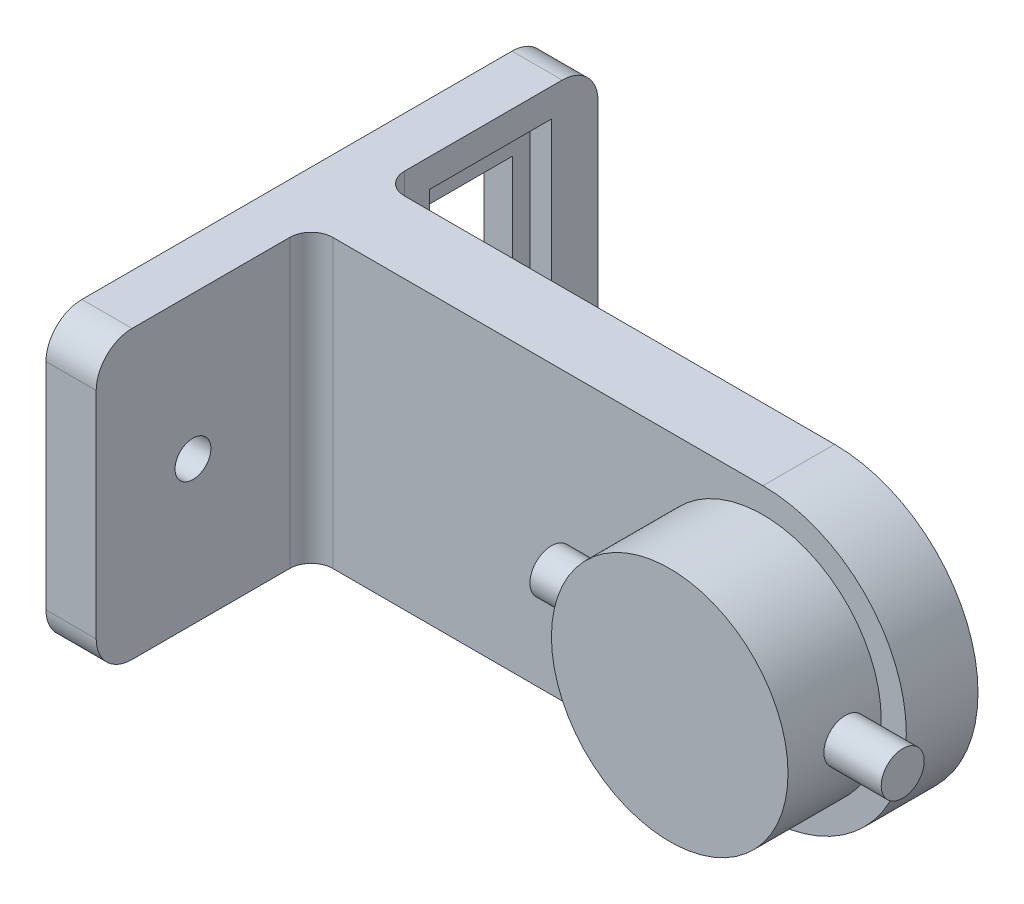
ISO-10303-21;
HEADER;
FILE_DESCRIPTION(('STEP AP214'),'2;1');
FILE_NAME('part.step','',(''),(''),'','','');
FILE_SCHEMA(('AUTOMOTIVE_DESIGN { 1 0 10303 214 1 1 1 1 }'));
ENDSEC;
DATA;
#1=APPLICATION_CONTEXT('core data for automotive mechanical design processes');
#2=APPLICATION_PROTOCOL_DEFINITION('international standard','automotive_design',2000,#1);
#3=PRODUCT_CONTEXT('',#1,'mechanical');
#4=PRODUCT('Part','Part','',(#3));
#5=PRODUCT_RELATED_PRODUCT_CATEGORY('part','',(#4));
#6=PRODUCT_DEFINITION_FORMATION('','',#4);
#7=PRODUCT_DEFINITION_CONTEXT('part definition',#1,'design');
#8=PRODUCT_DEFINITION('design','',#6,#7);
#9=PRODUCT_DEFINITION_SHAPE('','',#8);
#10=(LENGTH_UNIT() NAMED_UNIT(*) SI_UNIT(.MILLI.,.METRE.));
#11=(NAMED_UNIT(*) PLANE_ANGLE_UNIT() SI_UNIT($,.RADIAN.));
#12=(NAMED_UNIT(*) SI_UNIT($,.STERADIAN.) SOLID_ANGLE_UNIT());
#13=UNCERTAINTY_MEASURE_WITH_UNIT(LENGTH_MEASURE(1.E-05),#10,'distance_accuracy_value','');
#14=(GEOMETRIC_REPRESENTATION_CONTEXT(3) GLOBAL_UNCERTAINTY_ASSIGNED_CONTEXT((#13)) GLOBAL_UNIT_ASSIGNED_CONTEXT((#10,
#11,#12)) REPRESENTATION_CONTEXT('',''));
#15=CARTESIAN_POINT('',(0.,0.,0.));
#16=DIRECTION('',(0.,0.,1.));
#17=DIRECTION('',(1.,0.,0.));
#18=AXIS2_PLACEMENT_3D('',#15,#16,#17);
#19=CARTESIAN_POINT('',(0.499999999999973,0.,15.));
#20=DIRECTION('',(1.,0.,0.));
#21=DIRECTION('',(0.,1.,0.));
#22=AXIS2_PLACEMENT_3D('',#19,#20,#21);
#23=CYLINDRICAL_SURFACE('',#22,3.);
#24=CARTESIAN_POINT('',(0.499999999999973,0.,15.));
#25=DIRECTION('',(-1.,0.,0.));
#26=DIRECTION('',(0.,-1.,0.));
#27=AXIS2_PLACEMENT_3D('',#24,#25,#26);
#28=CIRCLE('',#27,3.);
#29=CARTESIAN_POINT('',(0.499999999999972,-3.,15.));
#30=VERTEX_POINT('',#29);
#31=EDGE_CURVE('E11',#30,#30,#28,.T.);
#32=ORIENTED_EDGE('',*,*,#31,.F.);
#33=EDGE_LOOP('',(#32));
#34=FACE_BOUND('',#33,.T.);
#35=CARTESIAN_POINT('',(8.49999999999997,0.,15.));
#36=DIRECTION('',(-1.,0.,0.));
#37=DIRECTION('',(0.,-1.,0.));
#38=AXIS2_PLACEMENT_3D('',#35,#36,#37);
#39=CIRCLE('',#38,3.);
#40=CARTESIAN_POINT('',(8.49999999999997,-3.,15.));
#41=VERTEX_POINT('',#40);
#42=EDGE_CURVE('E49',#41,#41,#39,.T.);
#43=ORIENTED_EDGE('',*,*,#42,.T.);
#44=EDGE_LOOP('',(#43));
#45=FACE_BOUND('',#44,.T.);
#46=ADVANCED_FACE('F46',(#34,#45),#23,.T.);
#47=CARTESIAN_POINT('',(0.499999999999973,0.,15.));
#48=DIRECTION('',(-1.,0.,0.));
#49=DIRECTION('',(0.,-1.,0.));
#50=AXIS2_PLACEMENT_3D('',#47,#48,#49);
#51=PLANE('',#50);
#52=ORIENTED_EDGE('',*,*,#31,.T.);
#53=EDGE_LOOP('',(#52));
#54=FACE_BOUND('',#53,.T.);
#55=ADVANCED_FACE('F61',(#54),#51,.T.);
#56=CARTESIAN_POINT('',(8.49999999999997,0.,15.));
#57=DIRECTION('',(-1.,0.,0.));
#58=DIRECTION('',(0.,-1.,0.));
#59=AXIS2_PLACEMENT_3D('',#56,#57,#58);
#60=PLANE('',#59);
#61=ORIENTED_EDGE('',*,*,#42,.F.);
#62=EDGE_LOOP('',(#61));
#63=FACE_BOUND('',#62,.T.);
#64=ADVANCED_FACE('F59',(#63),#60,.F.);
#65=CLOSED_SHELL('',(#46,#55,#64));
#66=MANIFOLD_SOLID_BREP('B2',#65);
#67=CARTESIAN_POINT('',(49.5,0.,15.));
#68=DIRECTION('',(-1.,0.,0.));
#69=DIRECTION('',(0.,-1.,0.));
#70=AXIS2_PLACEMENT_3D('',#67,#68,#69);
#71=CYLINDRICAL_SURFACE('',#70,3.);
#72=CARTESIAN_POINT('',(49.5,0.,15.));
#73=DIRECTION('',(1.,0.,0.));
#74=DIRECTION('',(0.,1.,0.));
#75=AXIS2_PLACEMENT_3D('',#72,#73,#74);
#76=CIRCLE('',#75,3.);
#77=CARTESIAN_POINT('',(49.5,3.,15.));
#78=VERTEX_POINT('',#77);
#79=EDGE_CURVE('E45',#78,#78,#76,.T.);
#80=ORIENTED_EDGE('',*,*,#79,.F.);
#81=EDGE_LOOP('',(#80));
#82=FACE_BOUND('',#81,.T.);
#83=CARTESIAN_POINT('',(41.5,0.,15.));
#84=DIRECTION('',(1.,0.,0.));
#85=DIRECTION('',(0.,1.,0.));
#86=AXIS2_PLACEMENT_3D('',#83,#84,#85);
#87=CIRCLE('',#86,3.);
#88=CARTESIAN_POINT('',(41.5,3.,15.));
#89=VERTEX_POINT('',#88);
#90=EDGE_CURVE('E105',#89,#89,#87,.T.);
#91=ORIENTED_EDGE('',*,*,#90,.T.);
#92=EDGE_LOOP('',(#91));
#93=FACE_BOUND('',#92,.T.);
#94=ADVANCED_FACE('F102',(#82,#93),#71,.T.);
#95=CARTESIAN_POINT('',(49.5,0.,15.));
#96=DIRECTION('',(1.,0.,0.));
#97=DIRECTION('',(0.,1.,0.));
#98=AXIS2_PLACEMENT_3D('',#95,#96,#97);
#99=PLANE('',#98);
#100=ORIENTED_EDGE('',*,*,#79,.T.);
#101=EDGE_LOOP('',(#100));
#102=FACE_BOUND('',#101,.T.);
#103=ADVANCED_FACE('F117',(#102),#99,.T.);
#104=CARTESIAN_POINT('',(41.5,0.,15.));
#105=DIRECTION('',(1.,0.,0.));
#106=DIRECTION('',(0.,1.,0.));
#107=AXIS2_PLACEMENT_3D('',#104,#105,#106);
#108=PLANE('',#107);
#109=ORIENTED_EDGE('',*,*,#90,.F.);
#110=EDGE_LOOP('',(#109));
#111=FACE_BOUND('',#110,.T.);
#112=ADVANCED_FACE('F115',(#111),#108,.F.);
#113=CLOSED_SHELL('',(#94,#103,#112));
#114=MANIFOLD_SOLID_BREP('B6',#113);
#115=CARTESIAN_POINT('',(-48.,11.275,-21.075));
#116=DIRECTION('',(0.,0.,1.));
#117=DIRECTION('',(1.,0.,0.));
#118=AXIS2_PLACEMENT_3D('',#115,#116,#117);
#119=PLANE('',#118);
#120=DIRECTION('',(1.,0.,0.));
#121=VECTOR('',#120,1.);
#122=CARTESIAN_POINT('',(-48.,-11.275,-21.075));
#123=LINE('',#122,#121);
#124=CARTESIAN_POINT('',(-45.,-11.275,-21.075));
#125=VERTEX_POINT('',#124);
#126=CARTESIAN_POINT('',(-41.,-11.275,-21.075));
#127=VERTEX_POINT('',#126);
#128=EDGE_CURVE('E360',#125,#127,#123,.T.);
#129=ORIENTED_EDGE('',*,*,#128,.T.);
#130=DIRECTION('',(0.,1.,0.));
#131=VECTOR('',#130,1.);
#132=CARTESIAN_POINT('',(-41.,11.275,-21.075));
#133=LINE('',#132,#131);
#134=CARTESIAN_POINT('',(-41.,11.275,-21.075));
#135=VERTEX_POINT('',#134);
#136=EDGE_CURVE('E348',#127,#135,#133,.T.);
#137=ORIENTED_EDGE('',*,*,#136,.T.);
#138=DIRECTION('',(1.,0.,0.));
#139=VECTOR('',#138,1.);
#140=CARTESIAN_POINT('',(-48.,11.275,-21.075));
#141=LINE('',#140,#139);
#142=CARTESIAN_POINT('',(-45.,11.275,-21.075));
#143=VERTEX_POINT('',#142);
#144=EDGE_CURVE('E351',#143,#135,#141,.T.);
#145=ORIENTED_EDGE('',*,*,#144,.F.);
#146=DIRECTION('',(0.,-1.,0.));
#147=VECTOR('',#146,1.);
#148=CARTESIAN_POINT('',(-45.,20.,-21.075));
#149=LINE('',#148,#147);
#150=EDGE_CURVE('E371',#143,#125,#149,.T.);
#151=ORIENTED_EDGE('',*,*,#150,.T.);
#152=EDGE_LOOP('',(#129,#137,#145,#151));
#153=FACE_BOUND('',#152,.T.);
#154=ADVANCED_FACE('F149',(#153),#119,.T.);
#155=CARTESIAN_POINT('',(-48.,-11.275,-21.075));
#156=DIRECTION('',(0.,1.,0.));
#157=DIRECTION('',(0.,0.,1.));
#158=AXIS2_PLACEMENT_3D('',#155,#156,#157);
#159=PLANE('',#158);
#160=DIRECTION('',(1.,0.,0.));
#161=VECTOR('',#160,1.);
#162=CARTESIAN_POINT('',(-48.,-11.275,-8.92500000000001));
#163=LINE('',#162,#161);
#164=CARTESIAN_POINT('',(-45.,-11.275,-8.92500000000001));
#165=VERTEX_POINT('',#164);
#166=CARTESIAN_POINT('',(-41.,-11.275,-8.92500000000001));
#167=VERTEX_POINT('',#166);
#168=EDGE_CURVE('E357',#165,#167,#163,.T.);
#169=ORIENTED_EDGE('',*,*,#168,.T.);
#170=DIRECTION('',(0.,0.,-1.));
#171=VECTOR('',#170,1.);
#172=CARTESIAN_POINT('',(-41.,-11.275,-21.075));
#173=LINE('',#172,#171);
#174=EDGE_CURVE('E345',#167,#127,#173,.T.);
#175=ORIENTED_EDGE('',*,*,#174,.T.);
#176=ORIENTED_EDGE('',*,*,#128,.F.);
#177=DIRECTION('',(0.,0.,1.));
#178=VECTOR('',#177,1.);
#179=CARTESIAN_POINT('',(-45.,-11.275,9.99999999999999));
#180=LINE('',#179,#178);
#181=EDGE_CURVE('E369',#125,#165,#180,.T.);
#182=ORIENTED_EDGE('',*,*,#181,.T.);
#183=EDGE_LOOP('',(#169,#175,#176,#182));
#184=FACE_BOUND('',#183,.T.);
#185=ADVANCED_FACE('F546',(#184),#159,.T.);
#186=CARTESIAN_POINT('',(-48.,11.275,-8.925));
#187=DIRECTION('',(0.,0.,1.));
#188=DIRECTION('',(0.,-1.,0.));
#189=AXIS2_PLACEMENT_3D('',#186,#187,#188);
#190=PLANE('',#189);
#191=DIRECTION('',(0.,1.,0.));
#192=VECTOR('',#191,1.);
#193=CARTESIAN_POINT('',(-41.,11.275,-8.925));
#194=LINE('',#193,#192);
#195=CARTESIAN_POINT('',(-41.,11.275,-8.925));
#196=VERTEX_POINT('',#195);
#197=EDGE_CURVE('E340',#167,#196,#194,.T.);
#198=ORIENTED_EDGE('',*,*,#197,.F.);
#199=ORIENTED_EDGE('',*,*,#168,.F.);
#200=DIRECTION('',(0.,-1.,0.));
#201=VECTOR('',#200,1.);
#202=CARTESIAN_POINT('',(-45.,20.,-8.925));
#203=LINE('',#202,#201);
#204=CARTESIAN_POINT('',(-45.,11.275,-8.92500000000001));
#205=VERTEX_POINT('',#204);
#206=EDGE_CURVE('E366',#205,#165,#203,.T.);
#207=ORIENTED_EDGE('',*,*,#206,.F.);
#208=DIRECTION('',(1.,0.,0.));
#209=VECTOR('',#208,1.);
#210=CARTESIAN_POINT('',(-48.,11.275,-8.925));
#211=LINE('',#210,#209);
#212=EDGE_CURVE('E354',#205,#196,#211,.T.);
#213=ORIENTED_EDGE('',*,*,#212,.T.);
#214=EDGE_LOOP('',(#198,#199,#207,#213));
#215=FACE_BOUND('',#214,.T.);
#216=ADVANCED_FACE('F552',(#215),#190,.F.);
#217=CARTESIAN_POINT('',(-48.,11.275,-21.075));
#218=DIRECTION('',(0.,1.,0.));
#219=DIRECTION('',(0.,0.,1.));
#220=AXIS2_PLACEMENT_3D('',#217,#218,#219);
#221=PLANE('',#220);
#222=DIRECTION('',(0.,0.,-1.));
#223=VECTOR('',#222,1.);
#224=CARTESIAN_POINT('',(-41.,11.275,-21.075));
#225=LINE('',#224,#223);
#226=EDGE_CURVE('E422',#196,#135,#225,.T.);
#227=ORIENTED_EDGE('',*,*,#226,.F.);
#228=ORIENTED_EDGE('',*,*,#212,.F.);
#229=DIRECTION('',(0.,0.,1.));
#230=VECTOR('',#229,1.);
#231=CARTESIAN_POINT('',(-45.,11.275,10.));
#232=LINE('',#231,#230);
#233=EDGE_CURVE('E363',#143,#205,#232,.T.);
#234=ORIENTED_EDGE('',*,*,#233,.F.);
#235=ORIENTED_EDGE('',*,*,#144,.T.);
#236=EDGE_LOOP('',(#227,#228,#234,#235));
#237=FACE_BOUND('',#236,.T.);
#238=ADVANCED_FACE('F584',(#237),#221,.F.);
#239=CARTESIAN_POINT('',(-45.,20.,10.));
#240=DIRECTION('',(1.,0.,0.));
#241=DIRECTION('',(0.,1.,0.));
#242=AXIS2_PLACEMENT_3D('',#239,#240,#241);
#243=PLANE('',#242);
#244=CARTESIAN_POINT('',(-45.,0.,26.5));
#245=DIRECTION('',(1.,0.,0.));
#246=DIRECTION('',(0.,1.,0.));
#247=AXIS2_PLACEMENT_3D('',#244,#245,#246);
#248=CIRCLE('',#247,2.5);
#249=CARTESIAN_POINT('',(-45.,2.5,26.5));
#250=VERTEX_POINT('',#249);
#251=EDGE_CURVE('E334',#250,#250,#248,.T.);
#252=ORIENTED_EDGE('',*,*,#251,.T.);
#253=EDGE_LOOP('',(#252));
#254=FACE_BOUND('',#253,.T.);
#255=DIRECTION('',(0.,0.,-1.));
#256=VECTOR('',#255,1.);
#257=CARTESIAN_POINT('',(-45.,-20.,10.));
#258=LINE('',#257,#256);
#259=CARTESIAN_POINT('',(-45.,-20.,35.));
#260=VERTEX_POINT('',#259);
#261=CARTESIAN_POINT('',(-45.,-20.,-25.));
#262=VERTEX_POINT('',#261);
#263=EDGE_CURVE('E419',#260,#262,#258,.T.);
#264=ORIENTED_EDGE('',*,*,#263,.F.);
#265=CARTESIAN_POINT('',(-45.,-15.,35.));
#266=DIRECTION('',(1.,0.,0.));
#267=DIRECTION('',(0.,1.,0.));
#268=AXIS2_PLACEMENT_3D('',#265,#266,#267);
#269=CIRCLE('',#268,5.);
#270=CARTESIAN_POINT('',(-45.,-15.,40.));
#271=VERTEX_POINT('',#270);
#272=EDGE_CURVE('E454',#260,#271,#269,.F.);
#273=ORIENTED_EDGE('',*,*,#272,.T.);
#274=DIRECTION('',(0.,1.,0.));
#275=VECTOR('',#274,1.);
#276=CARTESIAN_POINT('',(-45.,20.,40.));
#277=LINE('',#276,#275);
#278=CARTESIAN_POINT('',(-45.,15.,40.));
#279=VERTEX_POINT('',#278);
#280=EDGE_CURVE('E387',#271,#279,#277,.T.);
#281=ORIENTED_EDGE('',*,*,#280,.T.);
#282=CARTESIAN_POINT('',(-45.,15.,35.));
#283=DIRECTION('',(1.,0.,0.));
#284=DIRECTION('',(0.,1.,0.));
#285=AXIS2_PLACEMENT_3D('',#282,#283,#284);
#286=CIRCLE('',#285,5.);
#287=CARTESIAN_POINT('',(-45.,20.,35.));
#288=VERTEX_POINT('',#287);
#289=EDGE_CURVE('E452',#279,#288,#286,.F.);
#290=ORIENTED_EDGE('',*,*,#289,.T.);
#291=DIRECTION('',(0.,0.,-1.));
#292=VECTOR('',#291,1.);
#293=CARTESIAN_POINT('',(-45.,20.,10.));
#294=LINE('',#293,#292);
#295=CARTESIAN_POINT('',(-45.,20.,-25.));
#296=VERTEX_POINT('',#295);
#297=EDGE_CURVE('E405',#288,#296,#294,.T.);
#298=ORIENTED_EDGE('',*,*,#297,.T.);
#299=CARTESIAN_POINT('',(-45.,15.,-25.));
#300=DIRECTION('',(1.,0.,0.));
#301=DIRECTION('',(0.,1.,0.));
#302=AXIS2_PLACEMENT_3D('',#299,#300,#301);
#303=CIRCLE('',#302,5.);
#304=CARTESIAN_POINT('',(-45.,15.,-30.));
#305=VERTEX_POINT('',#304);
#306=EDGE_CURVE('E448',#296,#305,#303,.F.);
#307=ORIENTED_EDGE('',*,*,#306,.T.);
#308=DIRECTION('',(0.,1.,0.));
#309=VECTOR('',#308,1.);
#310=CARTESIAN_POINT('',(-45.,20.,-30.));
#311=LINE('',#310,#309);
#312=CARTESIAN_POINT('',(-45.,-15.,-30.));
#313=VERTEX_POINT('',#312);
#314=EDGE_CURVE('E381',#313,#305,#311,.T.);
#315=ORIENTED_EDGE('',*,*,#314,.F.);
#316=CARTESIAN_POINT('',(-45.,-15.,-25.));
#317=DIRECTION('',(1.,0.,0.));
#318=DIRECTION('',(0.,1.,0.));
#319=AXIS2_PLACEMENT_3D('',#316,#317,#318);
#320=CIRCLE('',#319,5.);
#321=EDGE_CURVE('E450',#313,#262,#320,.F.);
#322=ORIENTED_EDGE('',*,*,#321,.T.);
#323=EDGE_LOOP('',(#264,#273,#281,#290,#298,#307,#315,#322));
#324=FACE_BOUND('',#323,.T.);
#325=ORIENTED_EDGE('',*,*,#150,.F.);
#326=ORIENTED_EDGE('',*,*,#233,.T.);
#327=ORIENTED_EDGE('',*,*,#206,.T.);
#328=ORIENTED_EDGE('',*,*,#181,.F.);
#329=EDGE_LOOP('',(#325,#326,#327,#328));
#330=FACE_BOUND('',#329,.T.);
#331=ADVANCED_FACE('F484',(#254,#324,#330),#243,.F.);
#332=CARTESIAN_POINT('',(-38.,20.,40.));
#333=DIRECTION('',(1.,0.,0.));
#334=DIRECTION('',(0.,1.,0.));
#335=AXIS2_PLACEMENT_3D('',#332,#333,#334);
#336=PLANE('',#335);
#337=DIRECTION('',(0.,-1.,0.));
#338=VECTOR('',#337,1.);
#339=CARTESIAN_POINT('',(-38.,16.05,-6.50000000000001));
#340=LINE('',#339,#338);
#341=CARTESIAN_POINT('',(-38.,16.05,-6.50000000000001));
#342=VERTEX_POINT('',#341);
#343=CARTESIAN_POINT('',(-38.,-16.05,-6.50000000000001));
#344=VERTEX_POINT('',#343);
#345=EDGE_CURVE('E304',#342,#344,#340,.T.);
#346=ORIENTED_EDGE('',*,*,#345,.F.);
#347=DIRECTION('',(0.,0.,-1.));
#348=VECTOR('',#347,1.);
#349=CARTESIAN_POINT('',(-38.,16.05,-6.50000000000001));
#350=LINE('',#349,#348);
#351=CARTESIAN_POINT('',(-38.,16.05,-23.5));
#352=VERTEX_POINT('',#351);
#353=EDGE_CURVE('E321',#342,#352,#350,.T.);
#354=ORIENTED_EDGE('',*,*,#353,.T.);
#355=DIRECTION('',(0.,-1.,0.));
#356=VECTOR('',#355,1.);
#357=CARTESIAN_POINT('',(-38.,16.05,-23.5));
#358=LINE('',#357,#356);
#359=CARTESIAN_POINT('',(-38.,-16.05,-23.5));
#360=VERTEX_POINT('',#359);
#361=EDGE_CURVE('E324',#352,#360,#358,.T.);
#362=ORIENTED_EDGE('',*,*,#361,.T.);
#363=DIRECTION('',(0.,0.,-1.));
#364=VECTOR('',#363,1.);
#365=CARTESIAN_POINT('',(-38.,-16.05,-6.50000000000001));
#366=LINE('',#365,#364);
#367=EDGE_CURVE('E333',#344,#360,#366,.T.);
#368=ORIENTED_EDGE('',*,*,#367,.F.);
#369=EDGE_LOOP('',(#346,#354,#362,#368));
#370=FACE_BOUND('',#369,.T.);
#371=DIRECTION('',(0.,0.,-1.));
#372=VECTOR('',#371,1.);
#373=CARTESIAN_POINT('',(-38.,-20.,40.));
#374=LINE('',#373,#372);
#375=CARTESIAN_POINT('',(-38.,-20.,-3.));
#376=VERTEX_POINT('',#375);
#377=CARTESIAN_POINT('',(-38.,-20.,-25.));
#378=VERTEX_POINT('',#377);
#379=EDGE_CURVE('E394',#376,#378,#374,.T.);
#380=ORIENTED_EDGE('',*,*,#379,.T.);
#381=CARTESIAN_POINT('',(-38.,-15.,-25.));
#382=DIRECTION('',(1.,0.,0.));
#383=DIRECTION('',(0.,1.,0.));
#384=AXIS2_PLACEMENT_3D('',#381,#382,#383);
#385=CIRCLE('',#384,5.);
#386=CARTESIAN_POINT('',(-38.,-15.,-30.));
#387=VERTEX_POINT('',#386);
#388=EDGE_CURVE('E100',#378,#387,#385,.T.);
#389=ORIENTED_EDGE('',*,*,#388,.T.);
#390=DIRECTION('',(0.,-1.,0.));
#391=VECTOR('',#390,1.);
#392=CARTESIAN_POINT('',(-38.,20.,-30.));
#393=LINE('',#392,#391);
#394=CARTESIAN_POINT('',(-38.,15.,-30.));
#395=VERTEX_POINT('',#394);
#396=EDGE_CURVE('E377',#395,#387,#393,.T.);
#397=ORIENTED_EDGE('',*,*,#396,.F.);
#398=CARTESIAN_POINT('',(-38.,15.,-25.));
#399=DIRECTION('',(1.,0.,0.));
#400=DIRECTION('',(0.,1.,0.));
#401=AXIS2_PLACEMENT_3D('',#398,#399,#400);
#402=CIRCLE('',#401,5.);
#403=CARTESIAN_POINT('',(-38.,20.,-25.));
#404=VERTEX_POINT('',#403);
#405=EDGE_CURVE('E157',#395,#404,#402,.T.);
#406=ORIENTED_EDGE('',*,*,#405,.T.);
#407=DIRECTION('',(0.,0.,-1.));
#408=VECTOR('',#407,1.);
#409=CARTESIAN_POINT('',(-38.,20.,40.));
#410=LINE('',#409,#408);
#411=CARTESIAN_POINT('',(-38.,20.,-3.));
#412=VERTEX_POINT('',#411);
#413=EDGE_CURVE('E390',#412,#404,#410,.T.);
#414=ORIENTED_EDGE('',*,*,#413,.F.);
#415=DIRECTION('',(0.,1.,0.));
#416=VECTOR('',#415,1.);
#417=CARTESIAN_POINT('',(-38.,20.,-3.));
#418=LINE('',#417,#416);
#419=EDGE_CURVE('E432',#412,#376,#418,.F.);
#420=ORIENTED_EDGE('',*,*,#419,.T.);
#421=EDGE_LOOP('',(#380,#389,#397,#406,#414,#420));
#422=FACE_BOUND('',#421,.T.);
#423=ADVANCED_FACE('F475',(#370,#422),#336,.T.);
#424=CARTESIAN_POINT('',(-45.,-20.,10.));
#425=DIRECTION('',(0.,1.,0.));
#426=DIRECTION('',(-1.,0.,0.));
#427=AXIS2_PLACEMENT_3D('',#424,#425,#426);
#428=PLANE('',#427);
#429=CARTESIAN_POINT('',(-38.,-20.,35.));
#430=VERTEX_POINT('',#429);
#431=CARTESIAN_POINT('',(-38.,-20.,13.));
#432=VERTEX_POINT('',#431);
#433=EDGE_CURVE('E391',#430,#432,#374,.T.);
#434=ORIENTED_EDGE('',*,*,#433,.F.);
#435=DIRECTION('',(-1.,0.,0.));
#436=VECTOR('',#435,1.);
#437=CARTESIAN_POINT('',(-45.,-20.,35.));
#438=LINE('',#437,#436);
#439=EDGE_CURVE('E445',#430,#260,#438,.T.);
#440=ORIENTED_EDGE('',*,*,#439,.T.);
#441=ORIENTED_EDGE('',*,*,#263,.T.);
#442=DIRECTION('',(-1.,0.,0.));
#443=VECTOR('',#442,1.);
#444=CARTESIAN_POINT('',(-38.,-20.,-25.));
#445=LINE('',#444,#443);
#446=EDGE_CURVE('E443',#262,#378,#445,.F.);
#447=ORIENTED_EDGE('',*,*,#446,.T.);
#448=ORIENTED_EDGE('',*,*,#379,.F.);
#449=CARTESIAN_POINT('',(-35.,-20.,-3.));
#450=DIRECTION('',(0.,1.,0.));
#451=DIRECTION('',(-1.,0.,0.));
#452=AXIS2_PLACEMENT_3D('',#449,#450,#451);
#453=CIRCLE('',#452,3.);
#454=CARTESIAN_POINT('',(-35.,-20.,0.));
#455=VERTEX_POINT('',#454);
#456=EDGE_CURVE('E441',#376,#455,#453,.T.);
#457=ORIENTED_EDGE('',*,*,#456,.T.);
#458=DIRECTION('',(1.,0.,0.));
#459=VECTOR('',#458,1.);
#460=CARTESIAN_POINT('',(-45.,-20.,0.));
#461=LINE('',#460,#459);
#462=CARTESIAN_POINT('',(25.,-20.,0.));
#463=VERTEX_POINT('',#462);
#464=EDGE_CURVE('E393',#455,#463,#461,.T.);
#465=ORIENTED_EDGE('',*,*,#464,.T.);
#466=DIRECTION('',(0.,0.,-1.));
#467=VECTOR('',#466,1.);
#468=CARTESIAN_POINT('',(25.,-20.,10.));
#469=LINE('',#468,#467);
#470=CARTESIAN_POINT('',(25.,-20.,10.));
#471=VERTEX_POINT('',#470);
#472=EDGE_CURVE('E416',#471,#463,#469,.T.);
#473=ORIENTED_EDGE('',*,*,#472,.F.);
#474=DIRECTION('',(1.,0.,0.));
#475=VECTOR('',#474,1.);
#476=CARTESIAN_POINT('',(-45.,-20.,10.));
#477=LINE('',#476,#475);
#478=CARTESIAN_POINT('',(-35.,-20.,10.));
#479=VERTEX_POINT('',#478);
#480=EDGE_CURVE('E397',#479,#471,#477,.T.);
#481=ORIENTED_EDGE('',*,*,#480,.F.);
#482=CARTESIAN_POINT('',(-35.,-20.,13.));
#483=DIRECTION('',(0.,1.,0.));
#484=DIRECTION('',(-1.,0.,0.));
#485=AXIS2_PLACEMENT_3D('',#482,#483,#484);
#486=CIRCLE('',#485,3.);
#487=EDGE_CURVE('E436',#479,#432,#486,.T.);
#488=ORIENTED_EDGE('',*,*,#487,.T.);
#489=EDGE_LOOP('',(#434,#440,#441,#447,#448,#457,#465,#473,#481,#488));
#490=FACE_BOUND('',#489,.T.);
#491=ADVANCED_FACE('F494',(#490),#428,.F.);
#492=CARTESIAN_POINT('',(25.,0.,10.));
#493=DIRECTION('',(0.,0.,-1.));
#494=DIRECTION('',(-1.,0.,0.));
#495=AXIS2_PLACEMENT_3D('',#492,#493,#494);
#496=CYLINDRICAL_SURFACE('',#495,20.);
#497=CARTESIAN_POINT('',(25.,0.,0.));
#498=DIRECTION('',(0.,0.,1.));
#499=DIRECTION('',(1.,0.,0.));
#500=AXIS2_PLACEMENT_3D('',#497,#498,#499);
#501=CIRCLE('',#500,20.);
#502=CARTESIAN_POINT('',(25.,20.,0.));
#503=VERTEX_POINT('',#502);
#504=EDGE_CURVE('E407',#463,#503,#501,.T.);
#505=ORIENTED_EDGE('',*,*,#504,.T.);
#506=DIRECTION('',(0.,0.,-1.));
#507=VECTOR('',#506,1.);
#508=CARTESIAN_POINT('',(25.,20.,10.));
#509=LINE('',#508,#507);
#510=CARTESIAN_POINT('',(25.,20.,10.));
#511=VERTEX_POINT('',#510);
#512=EDGE_CURVE('E413',#511,#503,#509,.T.);
#513=ORIENTED_EDGE('',*,*,#512,.F.);
#514=CARTESIAN_POINT('',(25.,0.,10.));
#515=DIRECTION('',(0.,0.,1.));
#516=DIRECTION('',(1.,0.,0.));
#517=AXIS2_PLACEMENT_3D('',#514,#515,#516);
#518=CIRCLE('',#517,20.);
#519=EDGE_CURVE('E399',#471,#511,#518,.T.);
#520=ORIENTED_EDGE('',*,*,#519,.F.);
#521=ORIENTED_EDGE('',*,*,#472,.T.);
#522=EDGE_LOOP('',(#505,#513,#520,#521));
#523=FACE_BOUND('',#522,.T.);
#524=ADVANCED_FACE('F527',(#523),#496,.T.);
#525=CARTESIAN_POINT('',(-45.,20.,10.));
#526=DIRECTION('',(0.,-1.,0.));
#527=DIRECTION('',(1.,0.,0.));
#528=AXIS2_PLACEMENT_3D('',#525,#526,#527);
#529=PLANE('',#528);
#530=ORIENTED_EDGE('',*,*,#297,.F.);
#531=DIRECTION('',(1.,0.,0.));
#532=VECTOR('',#531,1.);
#533=CARTESIAN_POINT('',(-45.,20.,35.));
#534=LINE('',#533,#532);
#535=CARTESIAN_POINT('',(-38.,20.,35.));
#536=VERTEX_POINT('',#535);
#537=EDGE_CURVE('E466',#288,#536,#534,.T.);
#538=ORIENTED_EDGE('',*,*,#537,.T.);
#539=CARTESIAN_POINT('',(-38.,20.,13.));
#540=VERTEX_POINT('',#539);
#541=EDGE_CURVE('E395',#536,#540,#410,.T.);
#542=ORIENTED_EDGE('',*,*,#541,.T.);
#543=CARTESIAN_POINT('',(-35.,20.,13.));
#544=DIRECTION('',(0.,-1.,0.));
#545=DIRECTION('',(1.,0.,0.));
#546=AXIS2_PLACEMENT_3D('',#543,#544,#545);
#547=CIRCLE('',#546,3.);
#548=CARTESIAN_POINT('',(-35.,20.,10.));
#549=VERTEX_POINT('',#548);
#550=EDGE_CURVE('E434',#540,#549,#547,.T.);
#551=ORIENTED_EDGE('',*,*,#550,.T.);
#552=DIRECTION('',(-1.,0.,0.));
#553=VECTOR('',#552,1.);
#554=CARTESIAN_POINT('',(-45.,20.,10.));
#555=LINE('',#554,#553);
#556=EDGE_CURVE('E402',#511,#549,#555,.T.);
#557=ORIENTED_EDGE('',*,*,#556,.F.);
#558=ORIENTED_EDGE('',*,*,#512,.T.);
#559=DIRECTION('',(-1.,0.,0.));
#560=VECTOR('',#559,1.);
#561=CARTESIAN_POINT('',(-45.,20.,0.));
#562=LINE('',#561,#560);
#563=CARTESIAN_POINT('',(-35.,20.,0.));
#564=VERTEX_POINT('',#563);
#565=EDGE_CURVE('E400',#503,#564,#562,.T.);
#566=ORIENTED_EDGE('',*,*,#565,.T.);
#567=CARTESIAN_POINT('',(-35.,20.,-3.));
#568=DIRECTION('',(0.,-1.,0.));
#569=DIRECTION('',(1.,0.,0.));
#570=AXIS2_PLACEMENT_3D('',#567,#568,#569);
#571=CIRCLE('',#570,3.);
#572=EDGE_CURVE('E439',#564,#412,#571,.T.);
#573=ORIENTED_EDGE('',*,*,#572,.T.);
#574=ORIENTED_EDGE('',*,*,#413,.T.);
#575=DIRECTION('',(1.,0.,0.));
#576=VECTOR('',#575,1.);
#577=CARTESIAN_POINT('',(-45.,20.,-25.));
#578=LINE('',#577,#576);
#579=EDGE_CURVE('E464',#404,#296,#578,.F.);
#580=ORIENTED_EDGE('',*,*,#579,.T.);
#581=EDGE_LOOP('',(#530,#538,#542,#551,#557,#558,#566,#573,#574,#580));
#582=FACE_BOUND('',#581,.T.);
#583=ADVANCED_FACE('F479',(#582),#529,.F.);
#584=CARTESIAN_POINT('',(25.,0.,10.));
#585=DIRECTION('',(0.,0.,1.));
#586=DIRECTION('',(1.,0.,0.));
#587=AXIS2_PLACEMENT_3D('',#584,#585,#586);
#588=PLANE('',#587);
#589=CARTESIAN_POINT('',(25.,0.,10.));
#590=DIRECTION('',(0.,0.,1.));
#591=DIRECTION('',(1.,0.,0.));
#592=AXIS2_PLACEMENT_3D('',#589,#590,#591);
#593=CIRCLE('',#592,16.5);
#594=CARTESIAN_POINT('',(8.49999999999997,0.,10.));
#595=VERTEX_POINT('',#594);
#596=EDGE_CURVE('E373',#595,#595,#593,.T.);
#597=ORIENTED_EDGE('',*,*,#596,.F.);
#598=EDGE_LOOP('',(#597));
#599=FACE_BOUND('',#598,.T.);
#600=ORIENTED_EDGE('',*,*,#556,.T.);
#601=DIRECTION('',(0.,1.,0.));
#602=VECTOR('',#601,1.);
#603=CARTESIAN_POINT('',(-35.,-20.,10.));
#604=LINE('',#603,#602);
#605=EDGE_CURVE('E427',#549,#479,#604,.F.);
#606=ORIENTED_EDGE('',*,*,#605,.T.);
#607=ORIENTED_EDGE('',*,*,#480,.T.);
#608=ORIENTED_EDGE('',*,*,#519,.T.);
#609=EDGE_LOOP('',(#600,#606,#607,#608));
#610=FACE_BOUND('',#609,.T.);
#611=ADVANCED_FACE('F521',(#599,#610),#588,.T.);
#612=CARTESIAN_POINT('',(25.,0.,0.));
#613=DIRECTION('',(0.,0.,1.));
#614=DIRECTION('',(1.,0.,0.));
#615=AXIS2_PLACEMENT_3D('',#612,#613,#614);
#616=PLANE('',#615);
#617=ORIENTED_EDGE('',*,*,#464,.F.);
#618=DIRECTION('',(0.,1.,0.));
#619=VECTOR('',#618,1.);
#620=CARTESIAN_POINT('',(-35.,0.,0.));
#621=LINE('',#620,#619);
#622=EDGE_CURVE('E429',#455,#564,#621,.T.);
#623=ORIENTED_EDGE('',*,*,#622,.T.);
#624=ORIENTED_EDGE('',*,*,#565,.F.);
#625=ORIENTED_EDGE('',*,*,#504,.F.);
#626=EDGE_LOOP('',(#617,#623,#624,#625));
#627=FACE_BOUND('',#626,.T.);
#628=ADVANCED_FACE('F532',(#627),#616,.F.);
#629=CARTESIAN_POINT('',(0.,0.,-30.));
#630=DIRECTION('',(0.,0.,-1.));
#631=DIRECTION('',(-1.,0.,0.));
#632=AXIS2_PLACEMENT_3D('',#629,#630,#631);
#633=PLANE('',#632);
#634=ORIENTED_EDGE('',*,*,#396,.T.);
#635=DIRECTION('',(-1.,0.,0.));
#636=VECTOR('',#635,1.);
#637=CARTESIAN_POINT('',(-45.,-15.,-30.));
#638=LINE('',#637,#636);
#639=EDGE_CURVE('E471',#387,#313,#638,.T.);
#640=ORIENTED_EDGE('',*,*,#639,.T.);
#641=ORIENTED_EDGE('',*,*,#314,.T.);
#642=DIRECTION('',(1.,0.,0.));
#643=VECTOR('',#642,1.);
#644=CARTESIAN_POINT('',(-38.,15.,-30.));
#645=LINE('',#644,#643);
#646=EDGE_CURVE('E469',#305,#395,#645,.T.);
#647=ORIENTED_EDGE('',*,*,#646,.T.);
#648=EDGE_LOOP('',(#634,#640,#641,#647));
#649=FACE_BOUND('',#648,.T.);
#650=ADVANCED_FACE('F487',(#649),#633,.T.);
#651=CARTESIAN_POINT('',(-38.,0.,26.5));
#652=DIRECTION('',(1.,0.,0.));
#653=DIRECTION('',(0.,1.,0.));
#654=AXIS2_PLACEMENT_3D('',#651,#652,#653);
#655=CIRCLE('',#654,2.5);
#656=CARTESIAN_POINT('',(-38.,2.5,26.5));
#657=VERTEX_POINT('',#656);
#658=EDGE_CURVE('E327',#657,#657,#655,.T.);
#659=ORIENTED_EDGE('',*,*,#658,.F.);
#660=EDGE_LOOP('',(#659));
#661=FACE_BOUND('',#660,.T.);
#662=DIRECTION('',(0.,-1.,0.));
#663=VECTOR('',#662,1.);
#664=CARTESIAN_POINT('',(-38.,20.,40.));
#665=LINE('',#664,#663);
#666=CARTESIAN_POINT('',(-38.,15.,40.));
#667=VERTEX_POINT('',#666);
#668=CARTESIAN_POINT('',(-38.,-15.,40.));
#669=VERTEX_POINT('',#668);
#670=EDGE_CURVE('E384',#667,#669,#665,.T.);
#671=ORIENTED_EDGE('',*,*,#670,.T.);
#672=CARTESIAN_POINT('',(-38.,-15.,35.));
#673=DIRECTION('',(1.,0.,0.));
#674=DIRECTION('',(0.,1.,0.));
#675=AXIS2_PLACEMENT_3D('',#672,#673,#674);
#676=CIRCLE('',#675,5.);
#677=EDGE_CURVE('E462',#669,#430,#676,.T.);
#678=ORIENTED_EDGE('',*,*,#677,.T.);
#679=ORIENTED_EDGE('',*,*,#433,.T.);
#680=DIRECTION('',(0.,1.,0.));
#681=VECTOR('',#680,1.);
#682=CARTESIAN_POINT('',(-38.,20.,13.));
#683=LINE('',#682,#681);
#684=EDGE_CURVE('E424',#432,#540,#683,.T.);
#685=ORIENTED_EDGE('',*,*,#684,.T.);
#686=ORIENTED_EDGE('',*,*,#541,.F.);
#687=CARTESIAN_POINT('',(-38.,15.,35.));
#688=DIRECTION('',(1.,0.,0.));
#689=DIRECTION('',(0.,1.,0.));
#690=AXIS2_PLACEMENT_3D('',#687,#688,#689);
#691=CIRCLE('',#690,5.);
#692=EDGE_CURVE('E460',#536,#667,#691,.T.);
#693=ORIENTED_EDGE('',*,*,#692,.T.);
#694=EDGE_LOOP('',(#671,#678,#679,#685,#686,#693));
#695=FACE_BOUND('',#694,.T.);
#696=ADVANCED_FACE('F513',(#661,#695),#336,.T.);
#697=CARTESIAN_POINT('',(0.,0.,40.));
#698=DIRECTION('',(0.,0.,-1.));
#699=DIRECTION('',(-1.,0.,0.));
#700=AXIS2_PLACEMENT_3D('',#697,#698,#699);
#701=PLANE('',#700);
#702=ORIENTED_EDGE('',*,*,#280,.F.);
#703=DIRECTION('',(-1.,0.,0.));
#704=VECTOR('',#703,1.);
#705=CARTESIAN_POINT('',(0.,-15.,40.));
#706=LINE('',#705,#704);
#707=EDGE_CURVE('E458',#271,#669,#706,.F.);
#708=ORIENTED_EDGE('',*,*,#707,.T.);
#709=ORIENTED_EDGE('',*,*,#670,.F.);
#710=DIRECTION('',(1.,0.,0.));
#711=VECTOR('',#710,1.);
#712=CARTESIAN_POINT('',(0.,15.,40.));
#713=LINE('',#712,#711);
#714=EDGE_CURVE('E456',#667,#279,#713,.F.);
#715=ORIENTED_EDGE('',*,*,#714,.T.);
#716=EDGE_LOOP('',(#702,#708,#709,#715));
#717=FACE_BOUND('',#716,.T.);
#718=ADVANCED_FACE('F504',(#717),#701,.F.);
#719=CARTESIAN_POINT('',(25.,0.,23.));
#720=DIRECTION('',(0.,0.,-1.));
#721=DIRECTION('',(-1.,0.,0.));
#722=AXIS2_PLACEMENT_3D('',#719,#720,#721);
#723=CYLINDRICAL_SURFACE('',#722,16.5);
#724=CARTESIAN_POINT('',(25.,0.,23.));
#725=DIRECTION('',(0.,0.,1.));
#726=DIRECTION('',(1.,0.,0.));
#727=AXIS2_PLACEMENT_3D('',#724,#725,#726);
#728=CIRCLE('',#727,16.5);
#729=CARTESIAN_POINT('',(8.49999999999997,0.,23.));
#730=VERTEX_POINT('',#729);
#731=EDGE_CURVE('E374',#730,#730,#728,.T.);
#732=CARTESIAN_POINT('',(8.49999999999997,0.,23.));
#733=CARTESIAN_POINT('',(8.49999999999997,0.,22.8645833333333));
#734=CARTESIAN_POINT('',(8.49999999999997,0.,22.7291666666667));
#735=CARTESIAN_POINT('',(8.49999999999997,0.,22.4583333333333));
#736=CARTESIAN_POINT('',(8.49999999999997,0.,22.3229166666667));
#737=CARTESIAN_POINT('',(8.49999999999997,0.,22.0520833333333));
#738=CARTESIAN_POINT('',(8.49999999999997,0.,21.9166666666667));
#739=CARTESIAN_POINT('',(8.49999999999997,0.,21.6458333333333));
#740=CARTESIAN_POINT('',(8.49999999999997,0.,21.5104166666667));
#741=CARTESIAN_POINT('',(8.49999999999997,0.,21.2395833333333));
#742=CARTESIAN_POINT('',(8.49999999999997,0.,21.1041666666667));
#743=CARTESIAN_POINT('',(8.49999999999997,0.,20.8333333333333));
#744=CARTESIAN_POINT('',(8.49999999999997,0.,20.6979166666667));
#745=CARTESIAN_POINT('',(8.49999999999997,0.,20.4270833333333));
#746=CARTESIAN_POINT('',(8.49999999999997,0.,20.2916666666667));
#747=CARTESIAN_POINT('',(8.49999999999997,0.,20.0208333333333));
#748=CARTESIAN_POINT('',(8.49999999999997,0.,19.8854166666667));
#749=CARTESIAN_POINT('',(8.49999999999997,0.,19.6145833333333));
#750=CARTESIAN_POINT('',(8.49999999999997,0.,19.4791666666667));
#751=CARTESIAN_POINT('',(8.49999999999997,0.,19.2083333333333));
#752=CARTESIAN_POINT('',(8.49999999999997,0.,19.0729166666667));
#753=CARTESIAN_POINT('',(8.49999999999997,0.,18.8020833333333));
#754=CARTESIAN_POINT('',(8.49999999999997,0.,18.6666666666667));
#755=CARTESIAN_POINT('',(8.49999999999997,0.,18.3958333333333));
#756=CARTESIAN_POINT('',(8.49999999999997,0.,18.2604166666667));
#757=CARTESIAN_POINT('',(8.49999999999997,0.,17.9895833333333));
#758=CARTESIAN_POINT('',(8.49999999999997,0.,17.8541666666667));
#759=CARTESIAN_POINT('',(8.49999999999997,0.,17.5833333333333));
#760=CARTESIAN_POINT('',(8.49999999999997,0.,17.4479166666667));
#761=CARTESIAN_POINT('',(8.49999999999997,0.,17.1770833333333));
#762=CARTESIAN_POINT('',(8.49999999999997,0.,17.0416666666667));
#763=CARTESIAN_POINT('',(8.49999999999997,0.,16.7708333333333));
#764=CARTESIAN_POINT('',(8.49999999999997,0.,16.6354166666667));
#765=CARTESIAN_POINT('',(8.49999999999997,0.,16.3645833333333));
#766=CARTESIAN_POINT('',(8.49999999999997,0.,16.2291666666667));
#767=CARTESIAN_POINT('',(8.49999999999997,0.,15.9583333333333));
#768=CARTESIAN_POINT('',(8.49999999999997,0.,15.8229166666667));
#769=CARTESIAN_POINT('',(8.49999999999997,0.,15.5520833333333));
#770=CARTESIAN_POINT('',(8.49999999999997,0.,15.4166666666667));
#771=CARTESIAN_POINT('',(8.49999999999997,0.,15.1458333333333));
#772=CARTESIAN_POINT('',(8.49999999999997,0.,15.0104166666667));
#773=CARTESIAN_POINT('',(8.49999999999997,0.,14.7395833333333));
#774=CARTESIAN_POINT('',(8.49999999999997,0.,14.6041666666667));
#775=CARTESIAN_POINT('',(8.49999999999997,0.,14.3333333333333));
#776=CARTESIAN_POINT('',(8.49999999999997,0.,14.1979166666667));
#777=CARTESIAN_POINT('',(8.49999999999997,0.,13.9270833333333));
#778=CARTESIAN_POINT('',(8.49999999999997,0.,13.7916666666667));
#779=CARTESIAN_POINT('',(8.49999999999997,0.,13.5208333333333));
#780=CARTESIAN_POINT('',(8.49999999999997,0.,13.3854166666667));
#781=CARTESIAN_POINT('',(8.49999999999997,0.,13.1145833333333));
#782=CARTESIAN_POINT('',(8.49999999999997,0.,12.9791666666667));
#783=CARTESIAN_POINT('',(8.49999999999997,0.,12.7083333333333));
#784=CARTESIAN_POINT('',(8.49999999999997,0.,12.5729166666667));
#785=CARTESIAN_POINT('',(8.49999999999997,0.,12.3020833333333));
#786=CARTESIAN_POINT('',(8.49999999999997,0.,12.1666666666667));
#787=CARTESIAN_POINT('',(8.49999999999997,0.,11.8958333333333));
#788=CARTESIAN_POINT('',(8.49999999999997,0.,11.7604166666667));
#789=CARTESIAN_POINT('',(8.49999999999997,0.,11.4895833333333));
#790=CARTESIAN_POINT('',(8.49999999999997,0.,11.3541666666667));
#791=CARTESIAN_POINT('',(8.49999999999997,0.,11.0833333333333));
#792=CARTESIAN_POINT('',(8.49999999999997,0.,10.9479166666667));
#793=CARTESIAN_POINT('',(8.49999999999997,0.,10.6770833333333));
#794=CARTESIAN_POINT('',(8.49999999999997,0.,10.5416666666667));
#795=CARTESIAN_POINT('',(8.49999999999997,0.,10.2708333333333));
#796=CARTESIAN_POINT('',(8.49999999999997,0.,10.1354166666667));
#797=CARTESIAN_POINT('',(8.49999999999997,0.,10.));
#798=B_SPLINE_CURVE_WITH_KNOTS('',3,(#732,#733,#734,#735,#736,#737,#738,#739,#740,#741,#742,
#743,#744,#745,#746,#747,#748,#749,#750,#751,#752,#753,#754,#755,#756,#757,#758,#759,#760,#761,
#762,#763,#764,#765,#766,#767,#768,#769,#770,#771,#772,#773,#774,#775,#776,#777,#778,#779,#780,
#781,#782,#783,#784,#785,#786,#787,#788,#789,#790,#791,#792,#793,#794,#795,#796,#797),
.UNSPECIFIED.,.F.,.F.,(4,2,2,2,2,2,2,2,2,2,2,2,2,2,2,2,2,2,2,2,2,2,2,2,2,2,2,2,2,2,2,2,4),(0.,
0.40625,0.812500000000001,1.21875,1.625,2.03125,2.4375,2.84375,3.25,3.65625,4.0625,4.46875,
4.875,5.28125,5.6875,6.09375,6.5,6.90625,7.3125,7.71875,8.125,8.53125,8.9375,9.34375,9.75,
10.15625,10.5625,10.96875,11.375,11.78125,12.1875,12.59375,13.),.UNSPECIFIED.);
#799=EDGE_CURVE('BSEAM560',#730,#595,#798,.T.);
#800=ORIENTED_EDGE('',*,*,#731,.F.);
#801=ORIENTED_EDGE('',*,*,#596,.T.);
#802=ORIENTED_EDGE('',*,*,#799,.T.);
#803=ORIENTED_EDGE('',*,*,#799,.F.);
#804=EDGE_LOOP('',(#800,#802,#801,#803));
#805=FACE_BOUND('',#804,.T.);
#806=ADVANCED_FACE('F560',(#805),#723,.T.);
#807=CARTESIAN_POINT('',(25.,0.,23.));
#808=DIRECTION('',(0.,0.,1.));
#809=DIRECTION('',(1.,0.,0.));
#810=AXIS2_PLACEMENT_3D('',#807,#808,#809);
#811=PLANE('',#810);
#812=ORIENTED_EDGE('',*,*,#731,.T.);
#813=EDGE_LOOP('',(#812));
#814=FACE_BOUND('',#813,.T.);
#815=ADVANCED_FACE('F557',(#814),#811,.T.);
#816=CARTESIAN_POINT('',(-41.,16.05,-6.50000000000001));
#817=DIRECTION('',(0.,0.,1.));
#818=DIRECTION('',(0.,-1.,0.));
#819=AXIS2_PLACEMENT_3D('',#816,#817,#818);
#820=PLANE('',#819);
#821=ORIENTED_EDGE('',*,*,#345,.T.);
#822=DIRECTION('',(1.,0.,0.));
#823=VECTOR('',#822,1.);
#824=CARTESIAN_POINT('',(-41.,-16.05,-6.50000000000001));
#825=LINE('',#824,#823);
#826=CARTESIAN_POINT('',(-41.,-16.05,-6.50000000000001));
#827=VERTEX_POINT('',#826);
#828=EDGE_CURVE('E298',#827,#344,#825,.T.);
#829=ORIENTED_EDGE('',*,*,#828,.F.);
#830=DIRECTION('',(0.,-1.,0.));
#831=VECTOR('',#830,1.);
#832=CARTESIAN_POINT('',(-41.,16.05,-6.50000000000001));
#833=LINE('',#832,#831);
#834=CARTESIAN_POINT('',(-41.,16.05,-6.50000000000001));
#835=VERTEX_POINT('',#834);
#836=EDGE_CURVE('E302',#835,#827,#833,.T.);
#837=ORIENTED_EDGE('',*,*,#836,.F.);
#838=DIRECTION('',(1.,0.,0.));
#839=VECTOR('',#838,1.);
#840=CARTESIAN_POINT('',(-41.,16.05,-6.50000000000001));
#841=LINE('',#840,#839);
#842=EDGE_CURVE('E338',#835,#342,#841,.T.);
#843=ORIENTED_EDGE('',*,*,#842,.T.);
#844=EDGE_LOOP('',(#821,#829,#837,#843));
#845=FACE_BOUND('',#844,.T.);
#846=ADVANCED_FACE('F300',(#845),#820,.F.);
#847=CARTESIAN_POINT('',(-41.,16.05,-6.50000000000001));
#848=DIRECTION('',(0.,-1.,0.));
#849=DIRECTION('',(1.,0.,0.));
#850=AXIS2_PLACEMENT_3D('',#847,#848,#849);
#851=PLANE('',#850);
#852=ORIENTED_EDGE('',*,*,#353,.F.);
#853=ORIENTED_EDGE('',*,*,#842,.F.);
#854=DIRECTION('',(0.,0.,-1.));
#855=VECTOR('',#854,1.);
#856=CARTESIAN_POINT('',(-41.,16.05,-6.50000000000001));
#857=LINE('',#856,#855);
#858=CARTESIAN_POINT('',(-41.,16.05,-23.5));
#859=VERTEX_POINT('',#858);
#860=EDGE_CURVE('E309',#835,#859,#857,.T.);
#861=ORIENTED_EDGE('',*,*,#860,.T.);
#862=DIRECTION('',(1.,0.,0.));
#863=VECTOR('',#862,1.);
#864=CARTESIAN_POINT('',(-41.,16.05,-23.5));
#865=LINE('',#864,#863);
#866=EDGE_CURVE('E341',#859,#352,#865,.T.);
#867=ORIENTED_EDGE('',*,*,#866,.T.);
#868=EDGE_LOOP('',(#852,#853,#861,#867));
#869=FACE_BOUND('',#868,.T.);
#870=ADVANCED_FACE('F609',(#869),#851,.T.);
#871=CARTESIAN_POINT('',(-41.,16.05,-23.5));
#872=DIRECTION('',(0.,0.,1.));
#873=DIRECTION('',(0.,-1.,0.));
#874=AXIS2_PLACEMENT_3D('',#871,#872,#873);
#875=PLANE('',#874);
#876=ORIENTED_EDGE('',*,*,#361,.F.);
#877=ORIENTED_EDGE('',*,*,#866,.F.);
#878=DIRECTION('',(0.,-1.,0.));
#879=VECTOR('',#878,1.);
#880=CARTESIAN_POINT('',(-41.,16.05,-23.5));
#881=LINE('',#880,#879);
#882=CARTESIAN_POINT('',(-41.,-16.05,-23.5));
#883=VERTEX_POINT('',#882);
#884=EDGE_CURVE('E317',#859,#883,#881,.T.);
#885=ORIENTED_EDGE('',*,*,#884,.T.);
#886=DIRECTION('',(1.,0.,0.));
#887=VECTOR('',#886,1.);
#888=CARTESIAN_POINT('',(-41.,-16.05,-23.5));
#889=LINE('',#888,#887);
#890=EDGE_CURVE('E308',#883,#360,#889,.T.);
#891=ORIENTED_EDGE('',*,*,#890,.T.);
#892=EDGE_LOOP('',(#876,#877,#885,#891));
#893=FACE_BOUND('',#892,.T.);
#894=ADVANCED_FACE('F612',(#893),#875,.T.);
#895=CARTESIAN_POINT('',(-41.,-16.05,-6.50000000000001));
#896=DIRECTION('',(0.,-1.,0.));
#897=DIRECTION('',(1.,0.,0.));
#898=AXIS2_PLACEMENT_3D('',#895,#896,#897);
#899=PLANE('',#898);
#900=ORIENTED_EDGE('',*,*,#367,.T.);
#901=ORIENTED_EDGE('',*,*,#890,.F.);
#902=DIRECTION('',(0.,0.,-1.));
#903=VECTOR('',#902,1.);
#904=CARTESIAN_POINT('',(-41.,-16.05,-6.50000000000001));
#905=LINE('',#904,#903);
#906=EDGE_CURVE('E313',#827,#883,#905,.T.);
#907=ORIENTED_EDGE('',*,*,#906,.F.);
#908=ORIENTED_EDGE('',*,*,#828,.T.);
#909=EDGE_LOOP('',(#900,#901,#907,#908));
#910=FACE_BOUND('',#909,.T.);
#911=ADVANCED_FACE('F314',(#910),#899,.F.);
#912=CARTESIAN_POINT('',(-41.,0.,0.));
#913=DIRECTION('',(1.,0.,0.));
#914=DIRECTION('',(0.,1.,0.));
#915=AXIS2_PLACEMENT_3D('',#912,#913,#914);
#916=PLANE('',#915);
#917=ORIENTED_EDGE('',*,*,#174,.F.);
#918=ORIENTED_EDGE('',*,*,#197,.T.);
#919=ORIENTED_EDGE('',*,*,#226,.T.);
#920=ORIENTED_EDGE('',*,*,#136,.F.);
#921=EDGE_LOOP('',(#917,#918,#919,#920));
#922=FACE_BOUND('',#921,.T.);
#923=ORIENTED_EDGE('',*,*,#836,.T.);
#924=ORIENTED_EDGE('',*,*,#906,.T.);
#925=ORIENTED_EDGE('',*,*,#884,.F.);
#926=ORIENTED_EDGE('',*,*,#860,.F.);
#927=EDGE_LOOP('',(#923,#924,#925,#926));
#928=FACE_BOUND('',#927,.T.);
#929=ADVANCED_FACE('F320',(#922,#928),#916,.T.);
#930=CARTESIAN_POINT('',(-35.,20.,13.));
#931=DIRECTION('',(0.,-1.,0.));
#932=DIRECTION('',(1.,0.,0.));
#933=AXIS2_PLACEMENT_3D('',#930,#931,#932);
#934=CYLINDRICAL_SURFACE('',#933,3.);
#935=ORIENTED_EDGE('',*,*,#487,.F.);
#936=ORIENTED_EDGE('',*,*,#605,.F.);
#937=ORIENTED_EDGE('',*,*,#550,.F.);
#938=ORIENTED_EDGE('',*,*,#684,.F.);
#939=EDGE_LOOP('',(#935,#936,#937,#938));
#940=FACE_BOUND('',#939,.T.);
#941=ADVANCED_FACE('F517',(#940),#934,.F.);
#942=CARTESIAN_POINT('',(-35.,0.,-3.));
#943=DIRECTION('',(0.,1.,0.));
#944=DIRECTION('',(-1.,0.,0.));
#945=AXIS2_PLACEMENT_3D('',#942,#943,#944);
#946=CYLINDRICAL_SURFACE('',#945,3.);
#947=ORIENTED_EDGE('',*,*,#456,.F.);
#948=ORIENTED_EDGE('',*,*,#419,.F.);
#949=ORIENTED_EDGE('',*,*,#572,.F.);
#950=ORIENTED_EDGE('',*,*,#622,.F.);
#951=EDGE_LOOP('',(#947,#948,#949,#950));
#952=FACE_BOUND('',#951,.T.);
#953=ADVANCED_FACE('F536',(#952),#946,.F.);
#954=CARTESIAN_POINT('',(-45.,-15.,35.));
#955=DIRECTION('',(-1.,0.,0.));
#956=DIRECTION('',(0.,-1.,0.));
#957=AXIS2_PLACEMENT_3D('',#954,#955,#956);
#958=CYLINDRICAL_SURFACE('',#957,5.);
#959=ORIENTED_EDGE('',*,*,#677,.F.);
#960=ORIENTED_EDGE('',*,*,#707,.F.);
#961=ORIENTED_EDGE('',*,*,#272,.F.);
#962=ORIENTED_EDGE('',*,*,#439,.F.);
#963=EDGE_LOOP('',(#959,#960,#961,#962));
#964=FACE_BOUND('',#963,.T.);
#965=ADVANCED_FACE('F499',(#964),#958,.T.);
#966=CARTESIAN_POINT('',(-45.,15.,35.));
#967=DIRECTION('',(1.,0.,0.));
#968=DIRECTION('',(0.,1.,0.));
#969=AXIS2_PLACEMENT_3D('',#966,#967,#968);
#970=CYLINDRICAL_SURFACE('',#969,5.);
#971=ORIENTED_EDGE('',*,*,#289,.F.);
#972=ORIENTED_EDGE('',*,*,#714,.F.);
#973=ORIENTED_EDGE('',*,*,#692,.F.);
#974=ORIENTED_EDGE('',*,*,#537,.F.);
#975=EDGE_LOOP('',(#971,#972,#973,#974));
#976=FACE_BOUND('',#975,.T.);
#977=ADVANCED_FACE('F508',(#976),#970,.T.);
#978=CARTESIAN_POINT('',(0.,-15.,-25.));
#979=DIRECTION('',(1.,0.,0.));
#980=DIRECTION('',(0.,1.,0.));
#981=AXIS2_PLACEMENT_3D('',#978,#979,#980);
#982=CYLINDRICAL_SURFACE('',#981,5.);
#983=ORIENTED_EDGE('',*,*,#388,.F.);
#984=ORIENTED_EDGE('',*,*,#446,.F.);
#985=ORIENTED_EDGE('',*,*,#321,.F.);
#986=ORIENTED_EDGE('',*,*,#639,.F.);
#987=EDGE_LOOP('',(#983,#984,#985,#986));
#988=FACE_BOUND('',#987,.T.);
#989=ADVANCED_FACE('F490',(#988),#982,.T.);
#990=CARTESIAN_POINT('',(0.,15.,-25.));
#991=DIRECTION('',(-1.,0.,0.));
#992=DIRECTION('',(0.,-1.,0.));
#993=AXIS2_PLACEMENT_3D('',#990,#991,#992);
#994=CYLINDRICAL_SURFACE('',#993,5.);
#995=ORIENTED_EDGE('',*,*,#306,.F.);
#996=ORIENTED_EDGE('',*,*,#579,.F.);
#997=ORIENTED_EDGE('',*,*,#405,.F.);
#998=ORIENTED_EDGE('',*,*,#646,.F.);
#999=EDGE_LOOP('',(#995,#996,#997,#998));
#1000=FACE_BOUND('',#999,.T.);
#1001=ADVANCED_FACE('F151',(#1000),#994,.T.);
#1002=CARTESIAN_POINT('',(-45.,0.,26.5));
#1003=DIRECTION('',(1.,0.,0.));
#1004=DIRECTION('',(0.,1.,0.));
#1005=AXIS2_PLACEMENT_3D('',#1002,#1003,#1004);
#1006=CYLINDRICAL_SURFACE('',#1005,2.5);
#1007=ORIENTED_EDGE('',*,*,#251,.F.);
#1008=EDGE_LOOP('',(#1007));
#1009=FACE_BOUND('',#1008,.T.);
#1010=ORIENTED_EDGE('',*,*,#658,.T.);
#1011=EDGE_LOOP('',(#1010));
#1012=FACE_BOUND('',#1011,.T.);
#1013=ADVANCED_FACE('F599',(#1009,#1012),#1006,.F.);
#1014=CLOSED_SHELL('',(#154,#185,#216,#238,#331,#423,#491,#524,#583,#611,#628,#650,#696,#718,
#806,#815,#846,#870,#894,#911,#929,#941,#953,#965,#977,#989,#1001,#1013));
#1015=MANIFOLD_SOLID_BREP('B40',#1014);
#1016=ADVANCED_BREP_SHAPE_REPRESENTATION('',(#18,#66,#114,#1015),#14);
#1017=SHAPE_DEFINITION_REPRESENTATION(#9,#1016);
ENDSEC;
END-ISO-10303-21;
